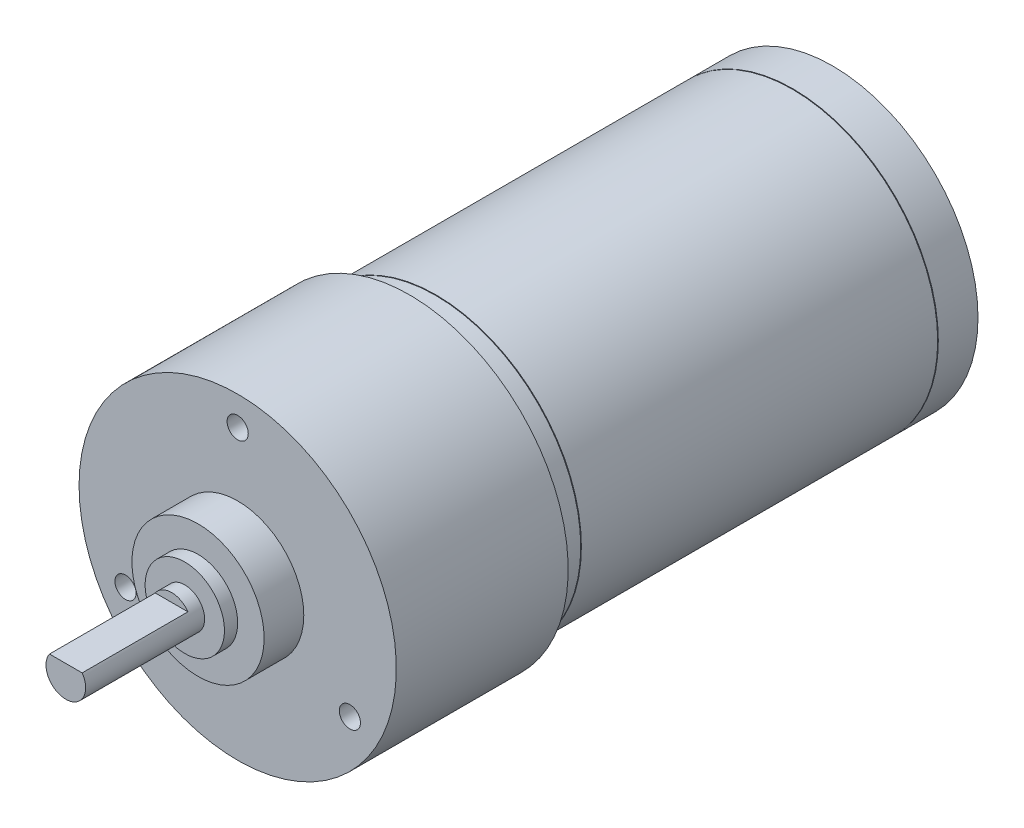
ISO-10303-21;
HEADER;
FILE_DESCRIPTION(('STEP AP214'),'2;1');
FILE_NAME('part.step','',(''),(''),'','','');
FILE_SCHEMA(('AUTOMOTIVE_DESIGN { 1 0 10303 214 1 1 1 1 }'));
ENDSEC;
DATA;
#1=APPLICATION_CONTEXT('core data for automotive mechanical design processes');
#2=APPLICATION_PROTOCOL_DEFINITION('international standard','automotive_design',2000,#1);
#3=PRODUCT_CONTEXT('',#1,'mechanical');
#4=PRODUCT('Part','Part','',(#3));
#5=PRODUCT_RELATED_PRODUCT_CATEGORY('part','',(#4));
#6=PRODUCT_DEFINITION_FORMATION('','',#4);
#7=PRODUCT_DEFINITION_CONTEXT('part definition',#1,'design');
#8=PRODUCT_DEFINITION('design','',#6,#7);
#9=PRODUCT_DEFINITION_SHAPE('','',#8);
#10=(LENGTH_UNIT() NAMED_UNIT(*) SI_UNIT(.MILLI.,.METRE.));
#11=(NAMED_UNIT(*) PLANE_ANGLE_UNIT() SI_UNIT($,.RADIAN.));
#12=(NAMED_UNIT(*) SI_UNIT($,.STERADIAN.) SOLID_ANGLE_UNIT());
#13=UNCERTAINTY_MEASURE_WITH_UNIT(LENGTH_MEASURE(1.E-05),#10,'distance_accuracy_value','');
#14=(GEOMETRIC_REPRESENTATION_CONTEXT(3) GLOBAL_UNCERTAINTY_ASSIGNED_CONTEXT((#13)) GLOBAL_UNIT_ASSIGNED_CONTEXT((#10,
#11,#12)) REPRESENTATION_CONTEXT('',''));
#15=CARTESIAN_POINT('',(0.,0.,0.));
#16=DIRECTION('',(0.,0.,1.));
#17=DIRECTION('',(1.,0.,0.));
#18=AXIS2_PLACEMENT_3D('',#15,#16,#17);
#19=CARTESIAN_POINT('',(0.,0.,49.));
#20=DIRECTION('',(0.,0.,1.));
#21=DIRECTION('',(1.,0.,0.));
#22=AXIS2_PLACEMENT_3D('',#19,#20,#21);
#23=PLANE('',#22);
#24=CARTESIAN_POINT('',(0.,0.,49.));
#25=DIRECTION('',(0.,0.,1.));
#26=DIRECTION('',(1.,0.,0.));
#27=AXIS2_PLACEMENT_3D('',#24,#25,#26);
#28=CIRCLE('',#27,3.);
#29=CARTESIAN_POINT('',(3.,0.,49.));
#30=VERTEX_POINT('',#29);
#31=EDGE_CURVE('E117',#30,#30,#28,.T.);
#32=ORIENTED_EDGE('',*,*,#31,.T.);
#33=EDGE_LOOP('',(#32));
#34=FACE_BOUND('',#33,.T.);
#35=CARTESIAN_POINT('',(0.,0.,49.));
#36=DIRECTION('',(0.,0.,1.));
#37=DIRECTION('',(1.,0.,0.));
#38=AXIS2_PLACEMENT_3D('',#35,#36,#37);
#39=CIRCLE('',#38,1.5);
#40=CARTESIAN_POINT('',(1.5,0.,49.));
#41=VERTEX_POINT('',#40);
#42=EDGE_CURVE('E116',#41,#41,#39,.F.);
#43=ORIENTED_EDGE('',*,*,#42,.T.);
#44=EDGE_LOOP('',(#43));
#45=FACE_BOUND('',#44,.T.);
#46=ADVANCED_FACE('F39',(#34,#45),#23,.T.);
#47=CARTESIAN_POINT('',(0.,0.,48.));
#48=DIRECTION('',(0.,0.,1.));
#49=DIRECTION('',(1.,0.,0.));
#50=AXIS2_PLACEMENT_3D('',#47,#48,#49);
#51=PLANE('',#50);
#52=CARTESIAN_POINT('',(0.,0.,48.));
#53=DIRECTION('',(0.,0.,1.));
#54=DIRECTION('',(1.,0.,0.));
#55=AXIS2_PLACEMENT_3D('',#52,#53,#54);
#56=CIRCLE('',#55,5.);
#57=CARTESIAN_POINT('',(5.,0.,48.));
#58=VERTEX_POINT('',#57);
#59=EDGE_CURVE('E121',#58,#58,#56,.T.);
#60=ORIENTED_EDGE('',*,*,#59,.T.);
#61=EDGE_LOOP('',(#60));
#62=FACE_BOUND('',#61,.T.);
#63=CARTESIAN_POINT('',(0.,0.,48.));
#64=DIRECTION('',(0.,0.,1.));
#65=DIRECTION('',(1.,0.,0.));
#66=AXIS2_PLACEMENT_3D('',#63,#64,#65);
#67=CIRCLE('',#66,3.);
#68=CARTESIAN_POINT('',(3.,0.,48.));
#69=VERTEX_POINT('',#68);
#70=EDGE_CURVE('E120',#69,#69,#67,.F.);
#71=ORIENTED_EDGE('',*,*,#70,.T.);
#72=EDGE_LOOP('',(#71));
#73=FACE_BOUND('',#72,.T.);
#74=ADVANCED_FACE('F199',(#62,#73),#51,.T.);
#75=CARTESIAN_POINT('',(0.,0.,45.));
#76=DIRECTION('',(0.,0.,1.));
#77=DIRECTION('',(1.,0.,0.));
#78=AXIS2_PLACEMENT_3D('',#75,#76,#77);
#79=PLANE('',#78);
#80=CARTESIAN_POINT('',(0.,9.8,45.));
#81=DIRECTION('',(0.,0.,1.));
#82=DIRECTION('',(1.,0.,0.));
#83=AXIS2_PLACEMENT_3D('',#80,#81,#82);
#84=CIRCLE('',#83,0.79999999999999);
#85=CARTESIAN_POINT('',(0.79999999999999,9.8,45.));
#86=VERTEX_POINT('',#85);
#87=EDGE_CURVE('E90',#86,#86,#84,.T.);
#88=ORIENTED_EDGE('',*,*,#87,.F.);
#89=EDGE_LOOP('',(#88));
#90=FACE_BOUND('',#89,.T.);
#91=CARTESIAN_POINT('',(8.48704895708811,-4.89999999999965,45.));
#92=DIRECTION('',(0.,0.,1.));
#93=DIRECTION('',(1.,0.,0.));
#94=AXIS2_PLACEMENT_3D('',#91,#92,#93);
#95=CIRCLE('',#94,0.79999999999999);
#96=CARTESIAN_POINT('',(9.2870489570881,-4.89999999999965,45.));
#97=VERTEX_POINT('',#96);
#98=EDGE_CURVE('E89',#97,#97,#95,.T.);
#99=ORIENTED_EDGE('',*,*,#98,.F.);
#100=EDGE_LOOP('',(#99));
#101=FACE_BOUND('',#100,.T.);
#102=CARTESIAN_POINT('',(-8.48704895708689,-4.90000000000035,45.));
#103=DIRECTION('',(0.,0.,1.));
#104=DIRECTION('',(1.,0.,0.));
#105=AXIS2_PLACEMENT_3D('',#102,#103,#104);
#106=CIRCLE('',#105,0.79999999999999);
#107=CARTESIAN_POINT('',(-7.6870489570869,-4.90000000000035,45.));
#108=VERTEX_POINT('',#107);
#109=EDGE_CURVE('E100',#108,#108,#106,.T.);
#110=ORIENTED_EDGE('',*,*,#109,.F.);
#111=EDGE_LOOP('',(#110));
#112=FACE_BOUND('',#111,.T.);
#113=CARTESIAN_POINT('',(0.,0.,45.));
#114=DIRECTION('',(0.,0.,1.));
#115=DIRECTION('',(1.,0.,0.));
#116=AXIS2_PLACEMENT_3D('',#113,#114,#115);
#117=CIRCLE('',#116,12.);
#118=CARTESIAN_POINT('',(-12.,0.,45.));
#119=VERTEX_POINT('',#118);
#120=EDGE_CURVE('E128',#119,#119,#117,.T.);
#121=ORIENTED_EDGE('',*,*,#120,.T.);
#122=EDGE_LOOP('',(#121));
#123=FACE_BOUND('',#122,.T.);
#124=CARTESIAN_POINT('',(0.,0.,45.));
#125=DIRECTION('',(0.,0.,1.));
#126=DIRECTION('',(1.,0.,0.));
#127=AXIS2_PLACEMENT_3D('',#124,#125,#126);
#128=CIRCLE('',#127,5.);
#129=CARTESIAN_POINT('',(5.,0.,45.));
#130=VERTEX_POINT('',#129);
#131=EDGE_CURVE('E125',#130,#130,#128,.T.);
#132=ORIENTED_EDGE('',*,*,#131,.F.);
#133=EDGE_LOOP('',(#132));
#134=FACE_BOUND('',#133,.T.);
#135=ADVANCED_FACE('F205',(#90,#101,#112,#123,#134),#79,.T.);
#136=CARTESIAN_POINT('',(0.,0.,32.));
#137=DIRECTION('',(0.,0.,-1.));
#138=DIRECTION('',(-1.,0.,0.));
#139=AXIS2_PLACEMENT_3D('',#136,#137,#138);
#140=CYLINDRICAL_SURFACE('',#139,11.);
#141=CARTESIAN_POINT('',(0.,0.,30.));
#142=DIRECTION('',(0.,0.,-1.));
#143=DIRECTION('',(-1.,0.,0.));
#144=AXIS2_PLACEMENT_3D('',#141,#142,#143);
#145=CIRCLE('',#144,11.);
#146=CARTESIAN_POINT('',(-11.,0.,30.));
#147=VERTEX_POINT('',#146);
#148=EDGE_CURVE('E143',#147,#147,#145,.T.);
#149=ORIENTED_EDGE('',*,*,#148,.T.);
#150=EDGE_LOOP('',(#149));
#151=FACE_BOUND('',#150,.T.);
#152=CARTESIAN_POINT('',(0.,0.,3.05));
#153=DIRECTION('',(0.,0.,-1.));
#154=DIRECTION('',(-1.,0.,0.));
#155=AXIS2_PLACEMENT_3D('',#152,#153,#154);
#156=CIRCLE('',#155,11.);
#157=CARTESIAN_POINT('',(-11.,0.,3.05));
#158=VERTEX_POINT('',#157);
#159=EDGE_CURVE('E158',#158,#158,#156,.T.);
#160=ORIENTED_EDGE('',*,*,#159,.F.);
#161=EDGE_LOOP('',(#160));
#162=FACE_BOUND('',#161,.T.);
#163=ADVANCED_FACE('F220',(#151,#162),#140,.T.);
#164=CARTESIAN_POINT('',(0.,0.,3.05));
#165=DIRECTION('',(0.,0.,-1.));
#166=DIRECTION('',(-1.,0.,0.));
#167=AXIS2_PLACEMENT_3D('',#164,#165,#166);
#168=PLANE('',#167);
#169=CARTESIAN_POINT('',(0.,0.,3.05));
#170=DIRECTION('',(0.,0.,-1.));
#171=DIRECTION('',(-1.,0.,0.));
#172=AXIS2_PLACEMENT_3D('',#169,#170,#171);
#173=CIRCLE('',#172,10.75);
#174=CARTESIAN_POINT('',(-10.75,0.,3.05));
#175=VERTEX_POINT('',#174);
#176=EDGE_CURVE('E146',#175,#175,#173,.T.);
#177=ORIENTED_EDGE('',*,*,#176,.F.);
#178=EDGE_LOOP('',(#177));
#179=FACE_BOUND('',#178,.T.);
#180=ORIENTED_EDGE('',*,*,#159,.T.);
#181=EDGE_LOOP('',(#180));
#182=FACE_BOUND('',#181,.T.);
#183=ADVANCED_FACE('F252',(#179,#182),#168,.T.);
#184=CARTESIAN_POINT('',(0.,0.,3.));
#185=DIRECTION('',(0.,0.,-1.));
#186=DIRECTION('',(-1.,0.,0.));
#187=AXIS2_PLACEMENT_3D('',#184,#185,#186);
#188=PLANE('',#187);
#189=CARTESIAN_POINT('',(0.,0.,3.));
#190=DIRECTION('',(0.,0.,-1.));
#191=DIRECTION('',(-1.,0.,0.));
#192=AXIS2_PLACEMENT_3D('',#189,#190,#191);
#193=CIRCLE('',#192,10.75);
#194=CARTESIAN_POINT('',(-10.75,0.,3.));
#195=VERTEX_POINT('',#194);
#196=EDGE_CURVE('E150',#195,#195,#193,.T.);
#197=ORIENTED_EDGE('',*,*,#196,.T.);
#198=EDGE_LOOP('',(#197));
#199=FACE_BOUND('',#198,.T.);
#200=CARTESIAN_POINT('',(0.,0.,3.));
#201=DIRECTION('',(0.,0.,-1.));
#202=DIRECTION('',(-1.,0.,0.));
#203=AXIS2_PLACEMENT_3D('',#200,#201,#202);
#204=CIRCLE('',#203,11.);
#205=CARTESIAN_POINT('',(-11.,0.,3.));
#206=VERTEX_POINT('',#205);
#207=EDGE_CURVE('E149',#206,#206,#204,.T.);
#208=ORIENTED_EDGE('',*,*,#207,.F.);
#209=EDGE_LOOP('',(#208));
#210=FACE_BOUND('',#209,.T.);
#211=ADVANCED_FACE('F250',(#199,#210),#188,.F.);
#212=CARTESIAN_POINT('',(0.,0.,3.05));
#213=DIRECTION('',(0.,0.,-1.));
#214=DIRECTION('',(-1.,0.,0.));
#215=AXIS2_PLACEMENT_3D('',#212,#213,#214);
#216=CYLINDRICAL_SURFACE('',#215,10.75);
#217=ORIENTED_EDGE('',*,*,#176,.T.);
#218=EDGE_LOOP('',(#217));
#219=FACE_BOUND('',#218,.T.);
#220=ORIENTED_EDGE('',*,*,#196,.F.);
#221=EDGE_LOOP('',(#220));
#222=FACE_BOUND('',#221,.T.);
#223=ADVANCED_FACE('F246',(#219,#222),#216,.T.);
#224=CARTESIAN_POINT('',(0.,0.,0.));
#225=DIRECTION('',(0.,0.,1.));
#226=DIRECTION('',(1.,0.,0.));
#227=AXIS2_PLACEMENT_3D('',#224,#225,#226);
#228=PLANE('',#227);
#229=CARTESIAN_POINT('',(0.,0.,0.));
#230=DIRECTION('',(0.,0.,1.));
#231=DIRECTION('',(1.,0.,0.));
#232=AXIS2_PLACEMENT_3D('',#229,#230,#231);
#233=CIRCLE('',#232,11.);
#234=CARTESIAN_POINT('',(11.,0.,0.));
#235=VERTEX_POINT('',#234);
#236=EDGE_CURVE('E161',#235,#235,#233,.T.);
#237=ORIENTED_EDGE('',*,*,#236,.F.);
#238=EDGE_LOOP('',(#237));
#239=FACE_BOUND('',#238,.T.);
#240=ADVANCED_FACE('F249',(#239),#228,.F.);
#241=ORIENTED_EDGE('',*,*,#207,.T.);
#242=EDGE_LOOP('',(#241));
#243=FACE_BOUND('',#242,.T.);
#244=ORIENTED_EDGE('',*,*,#236,.T.);
#245=EDGE_LOOP('',(#244));
#246=FACE_BOUND('',#245,.T.);
#247=ADVANCED_FACE('F41',(#243,#246),#140,.T.);
#248=CARTESIAN_POINT('',(0.,0.,30.05));
#249=DIRECTION('',(0.,0.,-1.));
#250=DIRECTION('',(-1.,0.,0.));
#251=AXIS2_PLACEMENT_3D('',#248,#249,#250);
#252=PLANE('',#251);
#253=CARTESIAN_POINT('',(0.,0.,30.05));
#254=DIRECTION('',(0.,0.,-1.));
#255=DIRECTION('',(-1.,0.,0.));
#256=AXIS2_PLACEMENT_3D('',#253,#254,#255);
#257=CIRCLE('',#256,10.75);
#258=CARTESIAN_POINT('',(-10.75,0.,30.05));
#259=VERTEX_POINT('',#258);
#260=EDGE_CURVE('E140',#259,#259,#257,.T.);
#261=ORIENTED_EDGE('',*,*,#260,.F.);
#262=EDGE_LOOP('',(#261));
#263=FACE_BOUND('',#262,.T.);
#264=CARTESIAN_POINT('',(0.,0.,30.05));
#265=DIRECTION('',(0.,0.,-1.));
#266=DIRECTION('',(-1.,0.,0.));
#267=AXIS2_PLACEMENT_3D('',#264,#265,#266);
#268=CIRCLE('',#267,11.);
#269=CARTESIAN_POINT('',(-11.,0.,30.05));
#270=VERTEX_POINT('',#269);
#271=EDGE_CURVE('E153',#270,#270,#268,.T.);
#272=ORIENTED_EDGE('',*,*,#271,.T.);
#273=EDGE_LOOP('',(#272));
#274=FACE_BOUND('',#273,.T.);
#275=ADVANCED_FACE('F239',(#263,#274),#252,.T.);
#276=CARTESIAN_POINT('',(0.,0.,30.));
#277=DIRECTION('',(0.,0.,-1.));
#278=DIRECTION('',(-1.,0.,0.));
#279=AXIS2_PLACEMENT_3D('',#276,#277,#278);
#280=PLANE('',#279);
#281=CARTESIAN_POINT('',(0.,0.,30.));
#282=DIRECTION('',(0.,0.,-1.));
#283=DIRECTION('',(-1.,0.,0.));
#284=AXIS2_PLACEMENT_3D('',#281,#282,#283);
#285=CIRCLE('',#284,10.75);
#286=CARTESIAN_POINT('',(-10.75,0.,30.));
#287=VERTEX_POINT('',#286);
#288=EDGE_CURVE('E139',#287,#287,#285,.T.);
#289=ORIENTED_EDGE('',*,*,#288,.T.);
#290=EDGE_LOOP('',(#289));
#291=FACE_BOUND('',#290,.T.);
#292=ORIENTED_EDGE('',*,*,#148,.F.);
#293=EDGE_LOOP('',(#292));
#294=FACE_BOUND('',#293,.T.);
#295=ADVANCED_FACE('F237',(#291,#294),#280,.F.);
#296=CARTESIAN_POINT('',(0.,0.,30.05));
#297=DIRECTION('',(0.,0.,-1.));
#298=DIRECTION('',(-1.,0.,0.));
#299=AXIS2_PLACEMENT_3D('',#296,#297,#298);
#300=CYLINDRICAL_SURFACE('',#299,10.75);
#301=ORIENTED_EDGE('',*,*,#260,.T.);
#302=EDGE_LOOP('',(#301));
#303=FACE_BOUND('',#302,.T.);
#304=ORIENTED_EDGE('',*,*,#288,.F.);
#305=EDGE_LOOP('',(#304));
#306=FACE_BOUND('',#305,.T.);
#307=ADVANCED_FACE('F234',(#303,#306),#300,.T.);
#308=CARTESIAN_POINT('',(0.,0.,32.));
#309=DIRECTION('',(0.,0.,1.));
#310=DIRECTION('',(1.,0.,0.));
#311=AXIS2_PLACEMENT_3D('',#308,#309,#310);
#312=CIRCLE('',#311,11.);
#313=CARTESIAN_POINT('',(11.,0.,32.));
#314=VERTEX_POINT('',#313);
#315=EDGE_CURVE('E162',#314,#314,#312,.T.);
#316=ORIENTED_EDGE('',*,*,#315,.F.);
#317=EDGE_LOOP('',(#316));
#318=FACE_BOUND('',#317,.T.);
#319=ORIENTED_EDGE('',*,*,#271,.F.);
#320=EDGE_LOOP('',(#319));
#321=FACE_BOUND('',#320,.T.);
#322=ADVANCED_FACE('F232',(#318,#321),#140,.T.);
#323=CARTESIAN_POINT('',(0.,0.,45.));
#324=DIRECTION('',(0.,0.,-1.));
#325=DIRECTION('',(-1.,0.,0.));
#326=AXIS2_PLACEMENT_3D('',#323,#324,#325);
#327=CYLINDRICAL_SURFACE('',#326,12.);
#328=CARTESIAN_POINT('',(0.,0.,32.));
#329=DIRECTION('',(0.,0.,1.));
#330=DIRECTION('',(1.,0.,0.));
#331=AXIS2_PLACEMENT_3D('',#328,#329,#330);
#332=CIRCLE('',#331,12.);
#333=CARTESIAN_POINT('',(-12.,0.,32.));
#334=VERTEX_POINT('',#333);
#335=EDGE_CURVE('E124',#334,#334,#332,.T.);
#336=CARTESIAN_POINT('',(-12.,0.,45.));
#337=CARTESIAN_POINT('',(-12.,0.,44.8645833333333));
#338=CARTESIAN_POINT('',(-12.,0.,44.7291666666667));
#339=CARTESIAN_POINT('',(-12.,0.,44.4583333333333));
#340=CARTESIAN_POINT('',(-12.,0.,44.3229166666667));
#341=CARTESIAN_POINT('',(-12.,0.,44.0520833333333));
#342=CARTESIAN_POINT('',(-12.,0.,43.9166666666667));
#343=CARTESIAN_POINT('',(-12.,0.,43.6458333333333));
#344=CARTESIAN_POINT('',(-12.,0.,43.5104166666667));
#345=CARTESIAN_POINT('',(-12.,0.,43.2395833333333));
#346=CARTESIAN_POINT('',(-12.,0.,43.1041666666667));
#347=CARTESIAN_POINT('',(-12.,0.,42.8333333333333));
#348=CARTESIAN_POINT('',(-12.,0.,42.6979166666667));
#349=CARTESIAN_POINT('',(-12.,0.,42.4270833333333));
#350=CARTESIAN_POINT('',(-12.,0.,42.2916666666667));
#351=CARTESIAN_POINT('',(-12.,0.,42.0208333333333));
#352=CARTESIAN_POINT('',(-12.,0.,41.8854166666667));
#353=CARTESIAN_POINT('',(-12.,0.,41.6145833333333));
#354=CARTESIAN_POINT('',(-12.,0.,41.4791666666667));
#355=CARTESIAN_POINT('',(-12.,0.,41.2083333333333));
#356=CARTESIAN_POINT('',(-12.,0.,41.0729166666667));
#357=CARTESIAN_POINT('',(-12.,0.,40.8020833333333));
#358=CARTESIAN_POINT('',(-12.,0.,40.6666666666667));
#359=CARTESIAN_POINT('',(-12.,0.,40.3958333333333));
#360=CARTESIAN_POINT('',(-12.,0.,40.2604166666667));
#361=CARTESIAN_POINT('',(-12.,0.,39.9895833333333));
#362=CARTESIAN_POINT('',(-12.,0.,39.8541666666667));
#363=CARTESIAN_POINT('',(-12.,0.,39.5833333333333));
#364=CARTESIAN_POINT('',(-12.,0.,39.4479166666667));
#365=CARTESIAN_POINT('',(-12.,0.,39.1770833333333));
#366=CARTESIAN_POINT('',(-12.,0.,39.0416666666667));
#367=CARTESIAN_POINT('',(-12.,0.,38.7708333333333));
#368=CARTESIAN_POINT('',(-12.,0.,38.6354166666667));
#369=CARTESIAN_POINT('',(-12.,0.,38.3645833333333));
#370=CARTESIAN_POINT('',(-12.,0.,38.2291666666667));
#371=CARTESIAN_POINT('',(-12.,0.,37.9583333333333));
#372=CARTESIAN_POINT('',(-12.,0.,37.8229166666667));
#373=CARTESIAN_POINT('',(-12.,0.,37.5520833333333));
#374=CARTESIAN_POINT('',(-12.,0.,37.4166666666667));
#375=CARTESIAN_POINT('',(-12.,0.,37.1458333333333));
#376=CARTESIAN_POINT('',(-12.,0.,37.0104166666667));
#377=CARTESIAN_POINT('',(-12.,0.,36.7395833333333));
#378=CARTESIAN_POINT('',(-12.,0.,36.6041666666667));
#379=CARTESIAN_POINT('',(-12.,0.,36.3333333333333));
#380=CARTESIAN_POINT('',(-12.,0.,36.1979166666667));
#381=CARTESIAN_POINT('',(-12.,0.,35.9270833333333));
#382=CARTESIAN_POINT('',(-12.,0.,35.7916666666667));
#383=CARTESIAN_POINT('',(-12.,0.,35.5208333333333));
#384=CARTESIAN_POINT('',(-12.,0.,35.3854166666667));
#385=CARTESIAN_POINT('',(-12.,0.,35.1145833333333));
#386=CARTESIAN_POINT('',(-12.,0.,34.9791666666667));
#387=CARTESIAN_POINT('',(-12.,0.,34.7083333333333));
#388=CARTESIAN_POINT('',(-12.,0.,34.5729166666667));
#389=CARTESIAN_POINT('',(-12.,0.,34.3020833333333));
#390=CARTESIAN_POINT('',(-12.,0.,34.1666666666667));
#391=CARTESIAN_POINT('',(-12.,0.,33.8958333333333));
#392=CARTESIAN_POINT('',(-12.,0.,33.7604166666667));
#393=CARTESIAN_POINT('',(-12.,0.,33.4895833333333));
#394=CARTESIAN_POINT('',(-12.,0.,33.3541666666667));
#395=CARTESIAN_POINT('',(-12.,0.,33.0833333333333));
#396=CARTESIAN_POINT('',(-12.,0.,32.9479166666667));
#397=CARTESIAN_POINT('',(-12.,0.,32.6770833333333));
#398=CARTESIAN_POINT('',(-12.,0.,32.5416666666667));
#399=CARTESIAN_POINT('',(-12.,0.,32.2708333333333));
#400=CARTESIAN_POINT('',(-12.,0.,32.1354166666667));
#401=CARTESIAN_POINT('',(-12.,0.,32.));
#402=B_SPLINE_CURVE_WITH_KNOTS('',3,(#336,#337,#338,#339,#340,#341,#342,#343,#344,#345,#346,
#347,#348,#349,#350,#351,#352,#353,#354,#355,#356,#357,#358,#359,#360,#361,#362,#363,#364,#365,
#366,#367,#368,#369,#370,#371,#372,#373,#374,#375,#376,#377,#378,#379,#380,#381,#382,#383,#384,
#385,#386,#387,#388,#389,#390,#391,#392,#393,#394,#395,#396,#397,#398,#399,#400,#401),
.UNSPECIFIED.,.F.,.F.,(4,2,2,2,2,2,2,2,2,2,2,2,2,2,2,2,2,2,2,2,2,2,2,2,2,2,2,2,2,2,2,2,4),(0.,
0.406249999999997,0.812499999999994,1.21875,1.62499999999999,2.03125,2.4375,2.84375,3.25,
3.65624999999999,4.0625,4.46874999999999,4.875,5.28124999999999,5.6875,6.09374999999999,6.5,
6.90625,7.31249999999999,7.71875,8.12499999999999,8.53125,8.93749999999999,9.34375,
9.74999999999999,10.15625,10.5625,10.96875,11.375,11.78125,12.1875,12.59375,13.),.UNSPECIFIED.);
#403=EDGE_CURVE('BSEAM229',#119,#334,#402,.T.);
#404=ORIENTED_EDGE('',*,*,#120,.F.);
#405=ORIENTED_EDGE('',*,*,#335,.T.);
#406=ORIENTED_EDGE('',*,*,#403,.T.);
#407=ORIENTED_EDGE('',*,*,#403,.F.);
#408=EDGE_LOOP('',(#404,#406,#405,#407));
#409=FACE_BOUND('',#408,.T.);
#410=ADVANCED_FACE('F229',(#409),#327,.T.);
#411=CARTESIAN_POINT('',(0.,0.,32.));
#412=DIRECTION('',(0.,0.,1.));
#413=DIRECTION('',(1.,0.,0.));
#414=AXIS2_PLACEMENT_3D('',#411,#412,#413);
#415=PLANE('',#414);
#416=ORIENTED_EDGE('',*,*,#335,.F.);
#417=EDGE_LOOP('',(#416));
#418=FACE_BOUND('',#417,.T.);
#419=ORIENTED_EDGE('',*,*,#315,.T.);
#420=EDGE_LOOP('',(#419));
#421=FACE_BOUND('',#420,.T.);
#422=ADVANCED_FACE('F216',(#418,#421),#415,.F.);
#423=CARTESIAN_POINT('',(0.,0.,48.));
#424=DIRECTION('',(0.,0.,-1.));
#425=DIRECTION('',(-1.,0.,0.));
#426=AXIS2_PLACEMENT_3D('',#423,#424,#425);
#427=CYLINDRICAL_SURFACE('',#426,5.);
#428=ORIENTED_EDGE('',*,*,#59,.F.);
#429=EDGE_LOOP('',(#428));
#430=FACE_BOUND('',#429,.T.);
#431=ORIENTED_EDGE('',*,*,#131,.T.);
#432=EDGE_LOOP('',(#431));
#433=FACE_BOUND('',#432,.T.);
#434=ADVANCED_FACE('F211',(#430,#433),#427,.T.);
#435=CARTESIAN_POINT('',(0.,0.,49.));
#436=DIRECTION('',(0.,0.,-1.));
#437=DIRECTION('',(-1.,0.,0.));
#438=AXIS2_PLACEMENT_3D('',#435,#436,#437);
#439=CYLINDRICAL_SURFACE('',#438,3.);
#440=ORIENTED_EDGE('',*,*,#70,.F.);
#441=EDGE_LOOP('',(#440));
#442=FACE_BOUND('',#441,.T.);
#443=ORIENTED_EDGE('',*,*,#31,.F.);
#444=EDGE_LOOP('',(#443));
#445=FACE_BOUND('',#444,.T.);
#446=ADVANCED_FACE('F195',(#442,#445),#439,.T.);
#447=CARTESIAN_POINT('',(0.,0.,58.));
#448=DIRECTION('',(0.,0.,-1.));
#449=DIRECTION('',(-1.,0.,0.));
#450=AXIS2_PLACEMENT_3D('',#447,#448,#449);
#451=CYLINDRICAL_SURFACE('',#450,1.5);
#452=CARTESIAN_POINT('',(0.,0.,58.));
#453=DIRECTION('',(0.,0.,1.));
#454=DIRECTION('',(1.,0.,0.));
#455=AXIS2_PLACEMENT_3D('',#452,#453,#454);
#456=CIRCLE('',#455,1.5);
#457=CARTESIAN_POINT('',(-1.23592070943083,0.85,58.));
#458=VERTEX_POINT('',#457);
#459=CARTESIAN_POINT('',(1.23592070943083,0.85,58.));
#460=VERTEX_POINT('',#459);
#461=EDGE_CURVE('E113',#458,#460,#456,.T.);
#462=ORIENTED_EDGE('',*,*,#461,.F.);
#463=DIRECTION('',(0.,0.,-1.));
#464=VECTOR('',#463,1.);
#465=CARTESIAN_POINT('',(-1.23592070943083,0.85,58.));
#466=LINE('',#465,#464);
#467=CARTESIAN_POINT('',(-1.23592070943083,0.85,50.));
#468=VERTEX_POINT('',#467);
#469=EDGE_CURVE('E55',#458,#468,#466,.T.);
#470=ORIENTED_EDGE('',*,*,#469,.T.);
#471=CARTESIAN_POINT('',(0.,0.,50.));
#472=DIRECTION('',(0.,0.,1.));
#473=DIRECTION('',(1.,0.,0.));
#474=AXIS2_PLACEMENT_3D('',#471,#472,#473);
#475=CIRCLE('',#474,1.5);
#476=CARTESIAN_POINT('',(1.23592070943083,0.85,50.));
#477=VERTEX_POINT('',#476);
#478=EDGE_CURVE('E11',#477,#468,#475,.T.);
#479=ORIENTED_EDGE('',*,*,#478,.F.);
#480=DIRECTION('',(0.,0.,-1.));
#481=VECTOR('',#480,1.);
#482=CARTESIAN_POINT('',(1.23592070943083,0.85,58.));
#483=LINE('',#482,#481);
#484=EDGE_CURVE('E109',#477,#460,#483,.F.);
#485=ORIENTED_EDGE('',*,*,#484,.T.);
#486=EDGE_LOOP('',(#462,#470,#479,#485));
#487=FACE_BOUND('',#486,.T.);
#488=ORIENTED_EDGE('',*,*,#42,.F.);
#489=EDGE_LOOP('',(#488));
#490=FACE_BOUND('',#489,.T.);
#491=ADVANCED_FACE('F183',(#487,#490),#451,.T.);
#492=CARTESIAN_POINT('',(0.,0.,58.));
#493=DIRECTION('',(0.,0.,1.));
#494=DIRECTION('',(1.,0.,0.));
#495=AXIS2_PLACEMENT_3D('',#492,#493,#494);
#496=PLANE('',#495);
#497=DIRECTION('',(1.,0.,0.));
#498=VECTOR('',#497,1.);
#499=CARTESIAN_POINT('',(0.,0.85,58.));
#500=LINE('',#499,#498);
#501=EDGE_CURVE('E48',#458,#460,#500,.T.);
#502=ORIENTED_EDGE('',*,*,#501,.F.);
#503=ORIENTED_EDGE('',*,*,#461,.T.);
#504=EDGE_LOOP('',(#502,#503));
#505=FACE_BOUND('',#504,.T.);
#506=ADVANCED_FACE('F185',(#505),#496,.T.);
#507=CARTESIAN_POINT('',(0.,0.,50.));
#508=DIRECTION('',(0.,0.,1.));
#509=DIRECTION('',(1.,0.,0.));
#510=AXIS2_PLACEMENT_3D('',#507,#508,#509);
#511=PLANE('',#510);
#512=ORIENTED_EDGE('',*,*,#478,.T.);
#513=DIRECTION('',(1.,0.,0.));
#514=VECTOR('',#513,1.);
#515=CARTESIAN_POINT('',(-2.23710149978965,0.85,50.));
#516=LINE('',#515,#514);
#517=EDGE_CURVE('E106',#468,#477,#516,.T.);
#518=ORIENTED_EDGE('',*,*,#517,.T.);
#519=EDGE_LOOP('',(#512,#518));
#520=FACE_BOUND('',#519,.T.);
#521=ADVANCED_FACE('F187',(#520),#511,.T.);
#522=CARTESIAN_POINT('',(-2.23710149978965,0.85,50.));
#523=DIRECTION('',(0.,-1.,0.));
#524=DIRECTION('',(0.,0.,-1.));
#525=AXIS2_PLACEMENT_3D('',#522,#523,#524);
#526=PLANE('',#525);
#527=ORIENTED_EDGE('',*,*,#501,.T.);
#528=ORIENTED_EDGE('',*,*,#484,.F.);
#529=ORIENTED_EDGE('',*,*,#517,.F.);
#530=ORIENTED_EDGE('',*,*,#469,.F.);
#531=EDGE_LOOP('',(#527,#528,#529,#530));
#532=FACE_BOUND('',#531,.T.);
#533=ADVANCED_FACE('F178',(#532),#526,.F.);
#534=CARTESIAN_POINT('',(-8.48704895708689,-4.90000000000035,39.8));
#535=DIRECTION('',(0.,0.,1.));
#536=DIRECTION('',(1.,0.,0.));
#537=AXIS2_PLACEMENT_3D('',#534,#535,#536);
#538=CONICAL_SURFACE('',#537,0.799999999999988,1.02974425867664);
#539=CARTESIAN_POINT('',(-8.48704895708689,-4.90000000000035,39.319311504778));
#540=VERTEX_POINT('',#539);
#541=VERTEX_LOOP('',#540);
#542=FACE_BOUND('',#541,.T.);
#543=CARTESIAN_POINT('',(-8.48704895708689,-4.90000000000035,39.8));
#544=DIRECTION('',(0.,0.,1.));
#545=DIRECTION('',(1.,0.,0.));
#546=AXIS2_PLACEMENT_3D('',#543,#544,#545);
#547=CIRCLE('',#546,0.799999999999988);
#548=CARTESIAN_POINT('',(-7.6870489570869,-4.90000000000035,39.8));
#549=VERTEX_POINT('',#548);
#550=EDGE_CURVE('E103',#549,#549,#547,.T.);
#551=ORIENTED_EDGE('',*,*,#550,.T.);
#552=EDGE_LOOP('',(#551));
#553=FACE_BOUND('',#552,.T.);
#554=ADVANCED_FACE('F426',(#542,#553),#538,.F.);
#555=CARTESIAN_POINT('',(-8.48704895708689,-4.90000000000035,45.));
#556=DIRECTION('',(0.,0.,1.));
#557=DIRECTION('',(1.,0.,0.));
#558=AXIS2_PLACEMENT_3D('',#555,#556,#557);
#559=CYLINDRICAL_SURFACE('',#558,0.799999999999989);
#560=ORIENTED_EDGE('',*,*,#550,.F.);
#561=EDGE_LOOP('',(#560));
#562=FACE_BOUND('',#561,.T.);
#563=ORIENTED_EDGE('',*,*,#109,.T.);
#564=EDGE_LOOP('',(#563));
#565=FACE_BOUND('',#564,.T.);
#566=ADVANCED_FACE('F440',(#562,#565),#559,.F.);
#567=CARTESIAN_POINT('',(8.48704895708811,-4.89999999999965,39.8));
#568=DIRECTION('',(0.,0.,1.));
#569=DIRECTION('',(1.,0.,0.));
#570=AXIS2_PLACEMENT_3D('',#567,#568,#569);
#571=CONICAL_SURFACE('',#570,0.799999999999988,1.02974425867664);
#572=CARTESIAN_POINT('',(8.48704895708811,-4.89999999999965,39.319311504778));
#573=VERTEX_POINT('',#572);
#574=VERTEX_LOOP('',#573);
#575=FACE_BOUND('',#574,.T.);
#576=CARTESIAN_POINT('',(8.48704895708811,-4.89999999999965,39.8));
#577=DIRECTION('',(0.,0.,1.));
#578=DIRECTION('',(1.,0.,0.));
#579=AXIS2_PLACEMENT_3D('',#576,#577,#578);
#580=CIRCLE('',#579,0.799999999999988);
#581=CARTESIAN_POINT('',(9.2870489570881,-4.89999999999965,39.8));
#582=VERTEX_POINT('',#581);
#583=EDGE_CURVE('E93',#582,#582,#580,.T.);
#584=ORIENTED_EDGE('',*,*,#583,.T.);
#585=EDGE_LOOP('',(#584));
#586=FACE_BOUND('',#585,.T.);
#587=ADVANCED_FACE('F450',(#575,#586),#571,.F.);
#588=CARTESIAN_POINT('',(8.48704895708811,-4.89999999999965,45.));
#589=DIRECTION('',(0.,0.,1.));
#590=DIRECTION('',(1.,0.,0.));
#591=AXIS2_PLACEMENT_3D('',#588,#589,#590);
#592=CYLINDRICAL_SURFACE('',#591,0.799999999999989);
#593=ORIENTED_EDGE('',*,*,#583,.F.);
#594=EDGE_LOOP('',(#593));
#595=FACE_BOUND('',#594,.T.);
#596=ORIENTED_EDGE('',*,*,#98,.T.);
#597=EDGE_LOOP('',(#596));
#598=FACE_BOUND('',#597,.T.);
#599=ADVANCED_FACE('F83',(#595,#598),#592,.F.);
#600=CARTESIAN_POINT('',(0.,9.8,39.8));
#601=DIRECTION('',(0.,0.,1.));
#602=DIRECTION('',(1.,0.,0.));
#603=AXIS2_PLACEMENT_3D('',#600,#601,#602);
#604=CONICAL_SURFACE('',#603,0.799999999999988,1.02974425867664);
#605=CARTESIAN_POINT('',(0.,9.8,39.319311504778));
#606=VERTEX_POINT('',#605);
#607=VERTEX_LOOP('',#606);
#608=FACE_BOUND('',#607,.T.);
#609=CARTESIAN_POINT('',(0.,9.8,39.8));
#610=DIRECTION('',(0.,0.,1.));
#611=DIRECTION('',(1.,0.,0.));
#612=AXIS2_PLACEMENT_3D('',#609,#610,#611);
#613=CIRCLE('',#612,0.799999999999988);
#614=CARTESIAN_POINT('',(0.799999999999988,9.8,39.8));
#615=VERTEX_POINT('',#614);
#616=EDGE_CURVE('E87',#615,#615,#613,.T.);
#617=ORIENTED_EDGE('',*,*,#616,.T.);
#618=EDGE_LOOP('',(#617));
#619=FACE_BOUND('',#618,.T.);
#620=ADVANCED_FACE('F79',(#608,#619),#604,.F.);
#621=CARTESIAN_POINT('',(0.,9.8,45.));
#622=DIRECTION('',(0.,0.,1.));
#623=DIRECTION('',(1.,0.,0.));
#624=AXIS2_PLACEMENT_3D('',#621,#622,#623);
#625=CYLINDRICAL_SURFACE('',#624,0.799999999999989);
#626=ORIENTED_EDGE('',*,*,#616,.F.);
#627=EDGE_LOOP('',(#626));
#628=FACE_BOUND('',#627,.T.);
#629=ORIENTED_EDGE('',*,*,#87,.T.);
#630=EDGE_LOOP('',(#629));
#631=FACE_BOUND('',#630,.T.);
#632=ADVANCED_FACE('F82',(#628,#631),#625,.F.);
#633=CLOSED_SHELL('',(#46,#74,#135,#163,#183,#211,#223,#240,#247,#275,#295,#307,#322,#410,#422,
#434,#446,#491,#506,#521,#533,#554,#566,#587,#599,#620,#632));
#634=CARTESIAN_POINT('',(0.,-8.5,26.8));
#635=DIRECTION('',(0.,0.,1.));
#636=DIRECTION('',(1.,0.,0.));
#637=AXIS2_PLACEMENT_3D('',#634,#635,#636);
#638=CONICAL_SURFACE('',#637,0.799999999999999,1.02974425867665);
#639=CARTESIAN_POINT('',(0.,-8.5,26.319311504778));
#640=VERTEX_POINT('',#639);
#641=VERTEX_LOOP('',#640);
#642=FACE_BOUND('',#641,.T.);
#643=CARTESIAN_POINT('',(0.,-8.5,26.8));
#644=DIRECTION('',(0.,0.,1.));
#645=DIRECTION('',(1.,0.,0.));
#646=AXIS2_PLACEMENT_3D('',#643,#644,#645);
#647=CIRCLE('',#646,0.799999999999999);
#648=CARTESIAN_POINT('',(0.799999999999999,-8.5,26.8));
#649=VERTEX_POINT('',#648);
#650=EDGE_CURVE('E157',#649,#649,#647,.T.);
#651=ORIENTED_EDGE('',*,*,#650,.T.);
#652=EDGE_LOOP('',(#651));
#653=FACE_BOUND('',#652,.T.);
#654=ADVANCED_FACE('F271',(#642,#653),#638,.F.);
#655=CARTESIAN_POINT('',(0.,-8.5,32.));
#656=DIRECTION('',(0.,0.,1.));
#657=DIRECTION('',(1.,0.,0.));
#658=AXIS2_PLACEMENT_3D('',#655,#656,#657);
#659=CYLINDRICAL_SURFACE('',#658,0.799999999999999);
#660=ORIENTED_EDGE('',*,*,#650,.F.);
#661=EDGE_LOOP('',(#660));
#662=FACE_BOUND('',#661,.T.);
#663=CARTESIAN_POINT('',(0.,-8.5,32.));
#664=DIRECTION('',(0.,0.,1.));
#665=DIRECTION('',(1.,0.,0.));
#666=AXIS2_PLACEMENT_3D('',#663,#664,#665);
#667=CIRCLE('',#666,0.799999999999999);
#668=CARTESIAN_POINT('',(0.799999999999999,-8.5,32.));
#669=VERTEX_POINT('',#668);
#670=EDGE_CURVE('E136',#669,#669,#667,.F.);
#671=ORIENTED_EDGE('',*,*,#670,.F.);
#672=EDGE_LOOP('',(#671));
#673=FACE_BOUND('',#672,.T.);
#674=ADVANCED_FACE('F225',(#662,#673),#659,.F.);
#675=ORIENTED_EDGE('',*,*,#670,.T.);
#676=EDGE_LOOP('',(#675));
#677=FACE_BOUND('',#676,.T.);
#678=ADVANCED_FACE('F222',(#677),#415,.F.);
#679=CLOSED_SHELL('',(#654,#674,#678));
#680=CARTESIAN_POINT('',(0.,8.5,26.8));
#681=DIRECTION('',(0.,0.,1.));
#682=DIRECTION('',(1.,0.,0.));
#683=AXIS2_PLACEMENT_3D('',#680,#681,#682);
#684=CONICAL_SURFACE('',#683,0.799999999999999,1.02974425867665);
#685=CARTESIAN_POINT('',(0.,8.5,26.319311504778));
#686=VERTEX_POINT('',#685);
#687=VERTEX_LOOP('',#686);
#688=FACE_BOUND('',#687,.T.);
#689=CARTESIAN_POINT('',(0.,8.5,26.8));
#690=DIRECTION('',(0.,0.,1.));
#691=DIRECTION('',(1.,0.,0.));
#692=AXIS2_PLACEMENT_3D('',#689,#690,#691);
#693=CIRCLE('',#692,0.799999999999999);
#694=CARTESIAN_POINT('',(0.799999999999999,8.5,26.8));
#695=VERTEX_POINT('',#694);
#696=EDGE_CURVE('E154',#695,#695,#693,.T.);
#697=ORIENTED_EDGE('',*,*,#696,.T.);
#698=EDGE_LOOP('',(#697));
#699=FACE_BOUND('',#698,.T.);
#700=ADVANCED_FACE('F262',(#688,#699),#684,.F.);
#701=CARTESIAN_POINT('',(0.,8.5,32.));
#702=DIRECTION('',(0.,0.,1.));
#703=DIRECTION('',(1.,0.,0.));
#704=AXIS2_PLACEMENT_3D('',#701,#702,#703);
#705=CYLINDRICAL_SURFACE('',#704,0.799999999999999);
#706=ORIENTED_EDGE('',*,*,#696,.F.);
#707=EDGE_LOOP('',(#706));
#708=FACE_BOUND('',#707,.T.);
#709=CARTESIAN_POINT('',(0.,8.5,32.));
#710=DIRECTION('',(0.,0.,1.));
#711=DIRECTION('',(1.,0.,0.));
#712=AXIS2_PLACEMENT_3D('',#709,#710,#711);
#713=CIRCLE('',#712,0.799999999999999);
#714=CARTESIAN_POINT('',(0.799999999999999,8.5,32.));
#715=VERTEX_POINT('',#714);
#716=EDGE_CURVE('E131',#715,#715,#713,.F.);
#717=ORIENTED_EDGE('',*,*,#716,.F.);
#718=EDGE_LOOP('',(#717));
#719=FACE_BOUND('',#718,.T.);
#720=ADVANCED_FACE('F259',(#708,#719),#705,.F.);
#721=ORIENTED_EDGE('',*,*,#716,.T.);
#722=EDGE_LOOP('',(#721));
#723=FACE_BOUND('',#722,.T.);
#724=ADVANCED_FACE('F227',(#723),#415,.F.);
#725=CLOSED_SHELL('',(#700,#720,#724));
#726=ORIENTED_CLOSED_SHELL('',*,#679,.T.);
#727=ORIENTED_CLOSED_SHELL('',*,#725,.T.);
#728=BREP_WITH_VOIDS('B2',#633,(#726,#727));
#729=ADVANCED_BREP_SHAPE_REPRESENTATION('',(#18,#728),#14);
#730=SHAPE_DEFINITION_REPRESENTATION(#9,#729);
ENDSEC;
END-ISO-10303-21;
